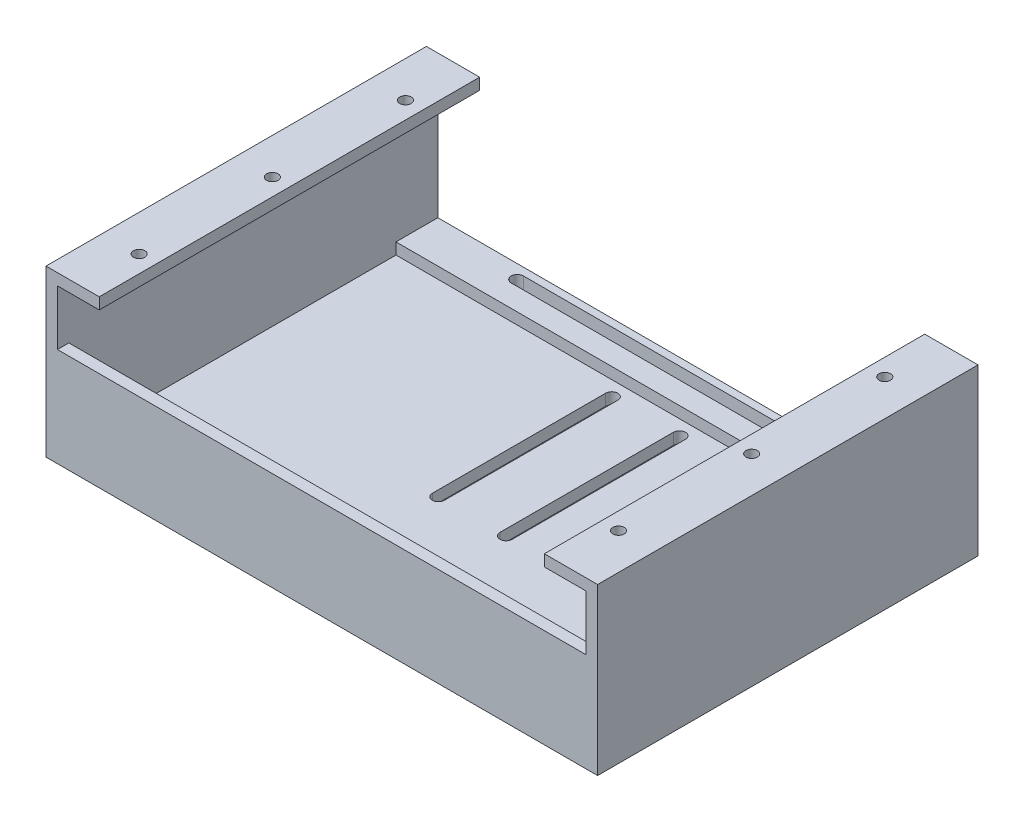
ISO-10303-21;
HEADER;
FILE_DESCRIPTION(('STEP AP214'),'2;1');
FILE_NAME('part.step','',(''),(''),'','','');
FILE_SCHEMA(('AUTOMOTIVE_DESIGN { 1 0 10303 214 1 1 1 1 }'));
ENDSEC;
DATA;
#1=APPLICATION_CONTEXT('core data for automotive mechanical design processes');
#2=APPLICATION_PROTOCOL_DEFINITION('international standard','automotive_design',2000,#1);
#3=PRODUCT_CONTEXT('',#1,'mechanical');
#4=PRODUCT('Part','Part','',(#3));
#5=PRODUCT_RELATED_PRODUCT_CATEGORY('part','',(#4));
#6=PRODUCT_DEFINITION_FORMATION('','',#4);
#7=PRODUCT_DEFINITION_CONTEXT('part definition',#1,'design');
#8=PRODUCT_DEFINITION('design','',#6,#7);
#9=PRODUCT_DEFINITION_SHAPE('','',#8);
#10=(LENGTH_UNIT() NAMED_UNIT(*) SI_UNIT(.MILLI.,.METRE.));
#11=(NAMED_UNIT(*) PLANE_ANGLE_UNIT() SI_UNIT($,.RADIAN.));
#12=(NAMED_UNIT(*) SI_UNIT($,.STERADIAN.) SOLID_ANGLE_UNIT());
#13=UNCERTAINTY_MEASURE_WITH_UNIT(LENGTH_MEASURE(1.E-05),#10,'distance_accuracy_value','');
#14=(GEOMETRIC_REPRESENTATION_CONTEXT(3) GLOBAL_UNCERTAINTY_ASSIGNED_CONTEXT((#13)) GLOBAL_UNIT_ASSIGNED_CONTEXT((#10,
#11,#12)) REPRESENTATION_CONTEXT('',''));
#15=CARTESIAN_POINT('',(0.,0.,0.));
#16=DIRECTION('',(0.,0.,1.));
#17=DIRECTION('',(1.,0.,0.));
#18=AXIS2_PLACEMENT_3D('',#15,#16,#17);
#19=CARTESIAN_POINT('',(69.5,43.5,0.));
#20=DIRECTION('',(-1.,0.,0.));
#21=DIRECTION('',(0.,0.,1.));
#22=AXIS2_PLACEMENT_3D('',#19,#20,#21);
#23=PLANE('',#22);
#24=DIRECTION('',(0.,0.,-1.));
#25=VECTOR('',#24,1.);
#26=CARTESIAN_POINT('',(69.5,6.,-50.));
#27=LINE('',#26,#25);
#28=CARTESIAN_POINT('',(69.5,6.,-39.));
#29=VERTEX_POINT('',#28);
#30=CARTESIAN_POINT('',(69.5,6.,-50.));
#31=VERTEX_POINT('',#30);
#32=EDGE_CURVE('E291',#29,#31,#27,.T.);
#33=ORIENTED_EDGE('',*,*,#32,.F.);
#34=DIRECTION('',(0.,1.,0.));
#35=VECTOR('',#34,1.);
#36=CARTESIAN_POINT('',(69.5,6.,-39.));
#37=LINE('',#36,#35);
#38=CARTESIAN_POINT('',(69.5,3.,-39.));
#39=VERTEX_POINT('',#38);
#40=EDGE_CURVE('E286',#39,#29,#37,.T.);
#41=ORIENTED_EDGE('',*,*,#40,.F.);
#42=DIRECTION('',(0.,0.,-1.));
#43=VECTOR('',#42,1.);
#44=CARTESIAN_POINT('',(69.5,3.,0.));
#45=LINE('',#44,#43);
#46=CARTESIAN_POINT('',(69.5,3.,47.));
#47=VERTEX_POINT('',#46);
#48=EDGE_CURVE('E529',#47,#39,#45,.T.);
#49=ORIENTED_EDGE('',*,*,#48,.F.);
#50=DIRECTION('',(0.,-1.,0.));
#51=VECTOR('',#50,1.);
#52=CARTESIAN_POINT('',(69.5,26.,47.));
#53=LINE('',#52,#51);
#54=CARTESIAN_POINT('',(69.5,26.,47.));
#55=VERTEX_POINT('',#54);
#56=EDGE_CURVE('E518',#55,#47,#53,.T.);
#57=ORIENTED_EDGE('',*,*,#56,.F.);
#58=DIRECTION('',(0.,0.,-1.));
#59=VECTOR('',#58,1.);
#60=CARTESIAN_POINT('',(69.5,26.,50.));
#61=LINE('',#60,#59);
#62=CARTESIAN_POINT('',(69.5,26.,50.));
#63=VERTEX_POINT('',#62);
#64=EDGE_CURVE('E503',#63,#55,#61,.T.);
#65=ORIENTED_EDGE('',*,*,#64,.F.);
#66=DIRECTION('',(0.,-1.,0.));
#67=VECTOR('',#66,1.);
#68=CARTESIAN_POINT('',(69.5,43.5,50.));
#69=LINE('',#68,#67);
#70=CARTESIAN_POINT('',(69.5,40.5,50.));
#71=VERTEX_POINT('',#70);
#72=EDGE_CURVE('E522',#71,#63,#69,.T.);
#73=ORIENTED_EDGE('',*,*,#72,.F.);
#74=DIRECTION('',(0.,0.,-1.));
#75=VECTOR('',#74,1.);
#76=CARTESIAN_POINT('',(69.5,40.5,0.));
#77=LINE('',#76,#75);
#78=CARTESIAN_POINT('',(69.5,40.5,-50.));
#79=VERTEX_POINT('',#78);
#80=EDGE_CURVE('E454',#71,#79,#77,.T.);
#81=ORIENTED_EDGE('',*,*,#80,.T.);
#82=DIRECTION('',(0.,-1.,0.));
#83=VECTOR('',#82,1.);
#84=CARTESIAN_POINT('',(69.5,43.5,-50.));
#85=LINE('',#84,#83);
#86=EDGE_CURVE('E523',#79,#31,#85,.T.);
#87=ORIENTED_EDGE('',*,*,#86,.T.);
#88=EDGE_LOOP('',(#33,#41,#49,#57,#65,#73,#81,#87));
#89=FACE_BOUND('',#88,.T.);
#90=ADVANCED_FACE('F45',(#89),#23,.T.);
#91=CARTESIAN_POINT('',(0.,3.,0.));
#92=DIRECTION('',(0.,1.,0.));
#93=DIRECTION('',(0.,0.,1.));
#94=AXIS2_PLACEMENT_3D('',#91,#92,#93);
#95=PLANE('',#94);
#96=CARTESIAN_POINT('',(-8.90000000000001,3.,10.4482548339604));
#97=DIRECTION('',(0.,1.,0.));
#98=DIRECTION('',(0.,0.,1.));
#99=AXIS2_PLACEMENT_3D('',#96,#97,#98);
#100=CIRCLE('',#99,1.59999999999999);
#101=CARTESIAN_POINT('',(-7.30000000000001,3.,10.4482548339604));
#102=VERTEX_POINT('',#101);
#103=CARTESIAN_POINT('',(-10.5,3.,10.4482548339604));
#104=VERTEX_POINT('',#103);
#105=EDGE_CURVE('E315',#102,#104,#100,.F.);
#106=ORIENTED_EDGE('',*,*,#105,.T.);
#107=DIRECTION('',(0.,0.,-1.));
#108=VECTOR('',#107,1.);
#109=CARTESIAN_POINT('',(-10.5,3.,10.4482548339604));
#110=LINE('',#109,#108);
#111=CARTESIAN_POINT('',(-10.5,3.,-35.1174060690302));
#112=VERTEX_POINT('',#111);
#113=EDGE_CURVE('E338',#104,#112,#110,.T.);
#114=ORIENTED_EDGE('',*,*,#113,.T.);
#115=CARTESIAN_POINT('',(-8.90000000000001,3.,-35.1174060690302));
#116=DIRECTION('',(0.,1.,0.));
#117=DIRECTION('',(0.,0.,1.));
#118=AXIS2_PLACEMENT_3D('',#115,#116,#117);
#119=CIRCLE('',#118,1.60000000000003);
#120=CARTESIAN_POINT('',(-7.29999999999999,3.,-35.1174060690302));
#121=VERTEX_POINT('',#120);
#122=EDGE_CURVE('E306',#112,#121,#119,.F.);
#123=ORIENTED_EDGE('',*,*,#122,.T.);
#124=DIRECTION('',(0.,0.,1.));
#125=VECTOR('',#124,1.);
#126=CARTESIAN_POINT('',(-7.30000000000001,3.,10.4482548339604));
#127=LINE('',#126,#125);
#128=EDGE_CURVE('E310',#121,#102,#127,.T.);
#129=ORIENTED_EDGE('',*,*,#128,.T.);
#130=EDGE_LOOP('',(#106,#114,#123,#129));
#131=FACE_BOUND('',#130,.T.);
#132=CARTESIAN_POINT('',(8.90000000000001,3.,10.4482548339604));
#133=DIRECTION('',(0.,1.,0.));
#134=DIRECTION('',(0.,0.,1.));
#135=AXIS2_PLACEMENT_3D('',#132,#133,#134);
#136=CIRCLE('',#135,1.59999999999999);
#137=CARTESIAN_POINT('',(10.5,3.,10.4482548339604));
#138=VERTEX_POINT('',#137);
#139=CARTESIAN_POINT('',(7.30000000000001,3.,10.4482548339604));
#140=VERTEX_POINT('',#139);
#141=EDGE_CURVE('E383',#138,#140,#136,.F.);
#142=ORIENTED_EDGE('',*,*,#141,.T.);
#143=DIRECTION('',(0.,0.,-1.));
#144=VECTOR('',#143,1.);
#145=CARTESIAN_POINT('',(7.30000000000001,3.,10.4482548339604));
#146=LINE('',#145,#144);
#147=CARTESIAN_POINT('',(7.29999999999998,3.,-35.1174060690302));
#148=VERTEX_POINT('',#147);
#149=EDGE_CURVE('E290',#140,#148,#146,.T.);
#150=ORIENTED_EDGE('',*,*,#149,.T.);
#151=CARTESIAN_POINT('',(8.90000000000003,3.,-35.1174060690302));
#152=DIRECTION('',(0.,1.,0.));
#153=DIRECTION('',(0.,0.,1.));
#154=AXIS2_PLACEMENT_3D('',#151,#152,#153);
#155=CIRCLE('',#154,1.60000000000003);
#156=CARTESIAN_POINT('',(10.5000000000001,3.,-35.1174060690302));
#157=VERTEX_POINT('',#156);
#158=EDGE_CURVE('E311',#148,#157,#155,.F.);
#159=ORIENTED_EDGE('',*,*,#158,.T.);
#160=DIRECTION('',(0.,0.,1.));
#161=VECTOR('',#160,1.);
#162=CARTESIAN_POINT('',(10.5,3.,10.4482548339604));
#163=LINE('',#162,#161);
#164=EDGE_CURVE('E387',#157,#138,#163,.T.);
#165=ORIENTED_EDGE('',*,*,#164,.T.);
#166=EDGE_LOOP('',(#142,#150,#159,#165));
#167=FACE_BOUND('',#166,.T.);
#168=ORIENTED_EDGE('',*,*,#48,.T.);
#169=DIRECTION('',(1.,0.,0.));
#170=VECTOR('',#169,1.);
#171=CARTESIAN_POINT('',(-72.502,3.,-39.));
#172=LINE('',#171,#170);
#173=CARTESIAN_POINT('',(-69.5,3.,-39.));
#174=VERTEX_POINT('',#173);
#175=EDGE_CURVE('E295',#174,#39,#172,.T.);
#176=ORIENTED_EDGE('',*,*,#175,.F.);
#177=DIRECTION('',(0.,0.,1.));
#178=VECTOR('',#177,1.);
#179=CARTESIAN_POINT('',(-69.5,3.,0.));
#180=LINE('',#179,#178);
#181=CARTESIAN_POINT('',(-69.5,3.,47.));
#182=VERTEX_POINT('',#181);
#183=EDGE_CURVE('E533',#174,#182,#180,.T.);
#184=ORIENTED_EDGE('',*,*,#183,.T.);
#185=DIRECTION('',(-1.,0.,0.));
#186=VECTOR('',#185,1.);
#187=CARTESIAN_POINT('',(69.5,3.,47.));
#188=LINE('',#187,#186);
#189=EDGE_CURVE('E494',#47,#182,#188,.T.);
#190=ORIENTED_EDGE('',*,*,#189,.F.);
#191=EDGE_LOOP('',(#168,#176,#184,#190));
#192=FACE_BOUND('',#191,.T.);
#193=ADVANCED_FACE('F641',(#131,#167,#192),#95,.T.);
#194=CARTESIAN_POINT('',(-69.5,43.5,0.));
#195=DIRECTION('',(1.,0.,0.));
#196=DIRECTION('',(0.,0.,-1.));
#197=AXIS2_PLACEMENT_3D('',#194,#195,#196);
#198=PLANE('',#197);
#199=ORIENTED_EDGE('',*,*,#183,.F.);
#200=DIRECTION('',(0.,-1.,0.));
#201=VECTOR('',#200,1.);
#202=CARTESIAN_POINT('',(-69.5,6.,-39.));
#203=LINE('',#202,#201);
#204=CARTESIAN_POINT('',(-69.5,6.,-39.));
#205=VERTEX_POINT('',#204);
#206=EDGE_CURVE('E246',#205,#174,#203,.T.);
#207=ORIENTED_EDGE('',*,*,#206,.F.);
#208=DIRECTION('',(0.,0.,1.));
#209=VECTOR('',#208,1.);
#210=CARTESIAN_POINT('',(-69.5,6.,-50.));
#211=LINE('',#210,#209);
#212=CARTESIAN_POINT('',(-69.5,6.,-50.));
#213=VERTEX_POINT('',#212);
#214=EDGE_CURVE('E281',#213,#205,#211,.T.);
#215=ORIENTED_EDGE('',*,*,#214,.F.);
#216=DIRECTION('',(0.,-1.,0.));
#217=VECTOR('',#216,1.);
#218=CARTESIAN_POINT('',(-69.5,43.5,-50.));
#219=LINE('',#218,#217);
#220=CARTESIAN_POINT('',(-69.5,40.5,-50.));
#221=VERTEX_POINT('',#220);
#222=EDGE_CURVE('E558',#221,#213,#219,.T.);
#223=ORIENTED_EDGE('',*,*,#222,.F.);
#224=DIRECTION('',(0.,0.,-1.));
#225=VECTOR('',#224,1.);
#226=CARTESIAN_POINT('',(-69.5,40.5,0.));
#227=LINE('',#226,#225);
#228=CARTESIAN_POINT('',(-69.5,40.5,50.));
#229=VERTEX_POINT('',#228);
#230=EDGE_CURVE('E487',#229,#221,#227,.T.);
#231=ORIENTED_EDGE('',*,*,#230,.F.);
#232=DIRECTION('',(0.,-1.,0.));
#233=VECTOR('',#232,1.);
#234=CARTESIAN_POINT('',(-69.5,43.5,50.));
#235=LINE('',#234,#233);
#236=CARTESIAN_POINT('',(-69.5,26.,50.));
#237=VERTEX_POINT('',#236);
#238=EDGE_CURVE('E555',#229,#237,#235,.T.);
#239=ORIENTED_EDGE('',*,*,#238,.T.);
#240=DIRECTION('',(0.,0.,1.));
#241=VECTOR('',#240,1.);
#242=CARTESIAN_POINT('',(-69.5,26.,47.));
#243=LINE('',#242,#241);
#244=CARTESIAN_POINT('',(-69.5,26.,47.));
#245=VERTEX_POINT('',#244);
#246=EDGE_CURVE('E495',#245,#237,#243,.T.);
#247=ORIENTED_EDGE('',*,*,#246,.F.);
#248=DIRECTION('',(0.,-1.,0.));
#249=VECTOR('',#248,1.);
#250=CARTESIAN_POINT('',(-69.5,26.,47.));
#251=LINE('',#250,#249);
#252=EDGE_CURVE('E511',#245,#182,#251,.T.);
#253=ORIENTED_EDGE('',*,*,#252,.T.);
#254=EDGE_LOOP('',(#199,#207,#215,#223,#231,#239,#247,#253));
#255=FACE_BOUND('',#254,.T.);
#256=ADVANCED_FACE('F634',(#255),#198,.T.);
#257=CARTESIAN_POINT('',(72.5,3.,-50.));
#258=DIRECTION('',(-1.,0.,0.));
#259=DIRECTION('',(0.,0.,1.));
#260=AXIS2_PLACEMENT_3D('',#257,#258,#259);
#261=PLANE('',#260);
#262=DIRECTION('',(0.,-1.,0.));
#263=VECTOR('',#262,1.);
#264=CARTESIAN_POINT('',(72.5,3.,50.));
#265=LINE('',#264,#263);
#266=CARTESIAN_POINT('',(72.5,43.5,50.));
#267=VERTEX_POINT('',#266);
#268=CARTESIAN_POINT('',(72.5,0.,50.));
#269=VERTEX_POINT('',#268);
#270=EDGE_CURVE('E580',#267,#269,#265,.T.);
#271=ORIENTED_EDGE('',*,*,#270,.T.);
#272=DIRECTION('',(0.,0.,-1.));
#273=VECTOR('',#272,1.);
#274=CARTESIAN_POINT('',(72.5,0.,-50.));
#275=LINE('',#274,#273);
#276=CARTESIAN_POINT('',(72.5,0.,-50.));
#277=VERTEX_POINT('',#276);
#278=EDGE_CURVE('E562',#269,#277,#275,.T.);
#279=ORIENTED_EDGE('',*,*,#278,.T.);
#280=DIRECTION('',(0.,-1.,0.));
#281=VECTOR('',#280,1.);
#282=CARTESIAN_POINT('',(72.5,3.,-50.));
#283=LINE('',#282,#281);
#284=CARTESIAN_POINT('',(72.5,43.5,-50.));
#285=VERTEX_POINT('',#284);
#286=EDGE_CURVE('E11',#285,#277,#283,.T.);
#287=ORIENTED_EDGE('',*,*,#286,.F.);
#288=DIRECTION('',(0.,0.,1.));
#289=VECTOR('',#288,1.);
#290=CARTESIAN_POINT('',(72.5,43.5,0.));
#291=LINE('',#290,#289);
#292=EDGE_CURVE('E537',#285,#267,#291,.T.);
#293=ORIENTED_EDGE('',*,*,#292,.T.);
#294=EDGE_LOOP('',(#271,#279,#287,#293));
#295=FACE_BOUND('',#294,.T.);
#296=ADVANCED_FACE('F47',(#295),#261,.F.);
#297=CARTESIAN_POINT('',(-72.5,3.,-50.));
#298=DIRECTION('',(0.,0.,1.));
#299=DIRECTION('',(1.,0.,0.));
#300=AXIS2_PLACEMENT_3D('',#297,#298,#299);
#301=PLANE('',#300);
#302=ORIENTED_EDGE('',*,*,#286,.T.);
#303=DIRECTION('',(-1.,0.,0.));
#304=VECTOR('',#303,1.);
#305=CARTESIAN_POINT('',(-72.5,0.,-50.));
#306=LINE('',#305,#304);
#307=CARTESIAN_POINT('',(-72.5,0.,-50.));
#308=VERTEX_POINT('',#307);
#309=EDGE_CURVE('E568',#277,#308,#306,.T.);
#310=ORIENTED_EDGE('',*,*,#309,.T.);
#311=DIRECTION('',(0.,-1.,0.));
#312=VECTOR('',#311,1.);
#313=CARTESIAN_POINT('',(-72.5,3.,-50.));
#314=LINE('',#313,#312);
#315=CARTESIAN_POINT('',(-72.5,43.5,-50.));
#316=VERTEX_POINT('',#315);
#317=EDGE_CURVE('E54',#316,#308,#314,.T.);
#318=ORIENTED_EDGE('',*,*,#317,.F.);
#319=DIRECTION('',(1.,0.,0.));
#320=VECTOR('',#319,1.);
#321=CARTESIAN_POINT('',(0.,43.5,-50.));
#322=LINE('',#321,#320);
#323=CARTESIAN_POINT('',(-58.5,43.5,-50.));
#324=VERTEX_POINT('',#323);
#325=EDGE_CURVE('E552',#316,#324,#322,.T.);
#326=ORIENTED_EDGE('',*,*,#325,.T.);
#327=DIRECTION('',(0.,1.,0.));
#328=VECTOR('',#327,1.);
#329=CARTESIAN_POINT('',(-58.5,40.5,-50.));
#330=LINE('',#329,#328);
#331=CARTESIAN_POINT('',(-58.5,40.5,-50.));
#332=VERTEX_POINT('',#331);
#333=EDGE_CURVE('E483',#332,#324,#330,.T.);
#334=ORIENTED_EDGE('',*,*,#333,.F.);
#335=DIRECTION('',(-1.,0.,0.));
#336=VECTOR('',#335,1.);
#337=CARTESIAN_POINT('',(-72.5,40.5,-50.));
#338=LINE('',#337,#336);
#339=EDGE_CURVE('E475',#332,#221,#338,.T.);
#340=ORIENTED_EDGE('',*,*,#339,.T.);
#341=ORIENTED_EDGE('',*,*,#222,.T.);
#342=DIRECTION('',(1.,0.,0.));
#343=VECTOR('',#342,1.);
#344=CARTESIAN_POINT('',(-72.502,6.,-50.));
#345=LINE('',#344,#343);
#346=EDGE_CURVE('E299',#213,#31,#345,.T.);
#347=ORIENTED_EDGE('',*,*,#346,.T.);
#348=ORIENTED_EDGE('',*,*,#86,.F.);
#349=DIRECTION('',(-1.,0.,0.));
#350=VECTOR('',#349,1.);
#351=CARTESIAN_POINT('',(72.5,40.5,-50.));
#352=LINE('',#351,#350);
#353=CARTESIAN_POINT('',(58.5,40.5,-50.));
#354=VERTEX_POINT('',#353);
#355=EDGE_CURVE('E459',#79,#354,#352,.T.);
#356=ORIENTED_EDGE('',*,*,#355,.T.);
#357=DIRECTION('',(0.,1.,0.));
#358=VECTOR('',#357,1.);
#359=CARTESIAN_POINT('',(58.5,40.5,-50.));
#360=LINE('',#359,#358);
#361=CARTESIAN_POINT('',(58.5,43.5,-50.));
#362=VERTEX_POINT('',#361);
#363=EDGE_CURVE('E442',#354,#362,#360,.T.);
#364=ORIENTED_EDGE('',*,*,#363,.T.);
#365=DIRECTION('',(1.,0.,0.));
#366=VECTOR('',#365,1.);
#367=CARTESIAN_POINT('',(0.,43.5,-50.));
#368=LINE('',#367,#366);
#369=EDGE_CURVE('E534',#362,#285,#368,.T.);
#370=ORIENTED_EDGE('',*,*,#369,.T.);
#371=EDGE_LOOP('',(#302,#310,#318,#326,#334,#340,#341,#347,#348,#356,#364,#370));
#372=FACE_BOUND('',#371,.T.);
#373=ADVANCED_FACE('F594',(#372),#301,.F.);
#374=CARTESIAN_POINT('',(-72.5,3.,-50.));
#375=DIRECTION('',(1.,0.,0.));
#376=DIRECTION('',(0.,0.,-1.));
#377=AXIS2_PLACEMENT_3D('',#374,#375,#376);
#378=PLANE('',#377);
#379=DIRECTION('',(0.,0.,1.));
#380=VECTOR('',#379,1.);
#381=CARTESIAN_POINT('',(-72.5,0.,-50.));
#382=LINE('',#381,#380);
#383=CARTESIAN_POINT('',(-72.5,0.,50.));
#384=VERTEX_POINT('',#383);
#385=EDGE_CURVE('E572',#308,#384,#382,.T.);
#386=ORIENTED_EDGE('',*,*,#385,.T.);
#387=DIRECTION('',(0.,-1.,0.));
#388=VECTOR('',#387,1.);
#389=CARTESIAN_POINT('',(-72.5,3.,50.));
#390=LINE('',#389,#388);
#391=CARTESIAN_POINT('',(-72.5,43.5,50.));
#392=VERTEX_POINT('',#391);
#393=EDGE_CURVE('E583',#392,#384,#390,.T.);
#394=ORIENTED_EDGE('',*,*,#393,.F.);
#395=DIRECTION('',(0.,0.,-1.));
#396=VECTOR('',#395,1.);
#397=CARTESIAN_POINT('',(-72.5,43.5,0.));
#398=LINE('',#397,#396);
#399=EDGE_CURVE('E548',#392,#316,#398,.T.);
#400=ORIENTED_EDGE('',*,*,#399,.T.);
#401=ORIENTED_EDGE('',*,*,#317,.T.);
#402=EDGE_LOOP('',(#386,#394,#400,#401));
#403=FACE_BOUND('',#402,.T.);
#404=ADVANCED_FACE('F587',(#403),#378,.F.);
#405=CARTESIAN_POINT('',(-72.5,3.,50.));
#406=DIRECTION('',(0.,0.,-1.));
#407=DIRECTION('',(-1.,0.,0.));
#408=AXIS2_PLACEMENT_3D('',#405,#406,#407);
#409=PLANE('',#408);
#410=DIRECTION('',(-1.,0.,0.));
#411=VECTOR('',#410,1.);
#412=CARTESIAN_POINT('',(0.,43.5,50.));
#413=LINE('',#412,#411);
#414=CARTESIAN_POINT('',(58.5,43.5,50.));
#415=VERTEX_POINT('',#414);
#416=EDGE_CURVE('E526',#267,#415,#413,.T.);
#417=ORIENTED_EDGE('',*,*,#416,.T.);
#418=DIRECTION('',(0.,1.,0.));
#419=VECTOR('',#418,1.);
#420=CARTESIAN_POINT('',(58.5,40.5,50.));
#421=LINE('',#420,#419);
#422=CARTESIAN_POINT('',(58.5,40.5,50.));
#423=VERTEX_POINT('',#422);
#424=EDGE_CURVE('E438',#423,#415,#421,.T.);
#425=ORIENTED_EDGE('',*,*,#424,.F.);
#426=DIRECTION('',(1.,0.,0.));
#427=VECTOR('',#426,1.);
#428=CARTESIAN_POINT('',(58.5,40.5,50.));
#429=LINE('',#428,#427);
#430=EDGE_CURVE('E455',#423,#71,#429,.T.);
#431=ORIENTED_EDGE('',*,*,#430,.T.);
#432=ORIENTED_EDGE('',*,*,#72,.T.);
#433=DIRECTION('',(1.,0.,0.));
#434=VECTOR('',#433,1.);
#435=CARTESIAN_POINT('',(-69.5,26.,50.));
#436=LINE('',#435,#434);
#437=EDGE_CURVE('E499',#237,#63,#436,.T.);
#438=ORIENTED_EDGE('',*,*,#437,.F.);
#439=ORIENTED_EDGE('',*,*,#238,.F.);
#440=DIRECTION('',(1.,0.,0.));
#441=VECTOR('',#440,1.);
#442=CARTESIAN_POINT('',(-58.5,40.5,50.));
#443=LINE('',#442,#441);
#444=CARTESIAN_POINT('',(-58.5,40.5,50.));
#445=VERTEX_POINT('',#444);
#446=EDGE_CURVE('E468',#229,#445,#443,.T.);
#447=ORIENTED_EDGE('',*,*,#446,.T.);
#448=DIRECTION('',(0.,1.,0.));
#449=VECTOR('',#448,1.);
#450=CARTESIAN_POINT('',(-58.5,40.5,50.));
#451=LINE('',#450,#449);
#452=CARTESIAN_POINT('',(-58.5,43.5,50.));
#453=VERTEX_POINT('',#452);
#454=EDGE_CURVE('E479',#445,#453,#451,.T.);
#455=ORIENTED_EDGE('',*,*,#454,.T.);
#456=DIRECTION('',(-1.,0.,0.));
#457=VECTOR('',#456,1.);
#458=CARTESIAN_POINT('',(0.,43.5,50.));
#459=LINE('',#458,#457);
#460=EDGE_CURVE('E544',#453,#392,#459,.T.);
#461=ORIENTED_EDGE('',*,*,#460,.T.);
#462=ORIENTED_EDGE('',*,*,#393,.T.);
#463=DIRECTION('',(1.,0.,0.));
#464=VECTOR('',#463,1.);
#465=CARTESIAN_POINT('',(-72.5,0.,50.));
#466=LINE('',#465,#464);
#467=EDGE_CURVE('E576',#384,#269,#466,.T.);
#468=ORIENTED_EDGE('',*,*,#467,.T.);
#469=ORIENTED_EDGE('',*,*,#270,.F.);
#470=EDGE_LOOP('',(#417,#425,#431,#432,#438,#439,#447,#455,#461,#462,#468,#469));
#471=FACE_BOUND('',#470,.T.);
#472=ADVANCED_FACE('F598',(#471),#409,.F.);
#473=CARTESIAN_POINT('',(0.,0.,0.));
#474=DIRECTION('',(0.,1.,0.));
#475=DIRECTION('',(0.,0.,1.));
#476=AXIS2_PLACEMENT_3D('',#473,#474,#475);
#477=PLANE('',#476);
#478=DIRECTION('',(1.,0.,0.));
#479=VECTOR('',#478,1.);
#480=CARTESIAN_POINT('',(-45.,0.,-48.));
#481=LINE('',#480,#479);
#482=CARTESIAN_POINT('',(-45.,0.,-48.));
#483=VERTEX_POINT('',#482);
#484=CARTESIAN_POINT('',(45.,0.,-48.));
#485=VERTEX_POINT('',#484);
#486=EDGE_CURVE('E252',#483,#485,#481,.T.);
#487=ORIENTED_EDGE('',*,*,#486,.F.);
#488=CARTESIAN_POINT('',(-45.,0.,-46.4));
#489=DIRECTION('',(0.,1.,0.));
#490=DIRECTION('',(0.,0.,1.));
#491=AXIS2_PLACEMENT_3D('',#488,#489,#490);
#492=CIRCLE('',#491,1.6);
#493=CARTESIAN_POINT('',(-45.,0.,-44.8));
#494=VERTEX_POINT('',#493);
#495=EDGE_CURVE('E232',#494,#483,#492,.F.);
#496=ORIENTED_EDGE('',*,*,#495,.F.);
#497=DIRECTION('',(-1.,0.,0.));
#498=VECTOR('',#497,1.);
#499=CARTESIAN_POINT('',(-45.,0.,-44.8));
#500=LINE('',#499,#498);
#501=CARTESIAN_POINT('',(45.,0.,-44.8));
#502=VERTEX_POINT('',#501);
#503=EDGE_CURVE('E242',#502,#494,#500,.T.);
#504=ORIENTED_EDGE('',*,*,#503,.F.);
#505=CARTESIAN_POINT('',(45.,0.,-46.4));
#506=DIRECTION('',(0.,1.,0.));
#507=DIRECTION('',(0.,0.,1.));
#508=AXIS2_PLACEMENT_3D('',#505,#506,#507);
#509=CIRCLE('',#508,1.59999999999999);
#510=EDGE_CURVE('E61',#485,#502,#509,.F.);
#511=ORIENTED_EDGE('',*,*,#510,.F.);
#512=EDGE_LOOP('',(#487,#496,#504,#511));
#513=FACE_BOUND('',#512,.T.);
#514=DIRECTION('',(0.,0.,-1.));
#515=VECTOR('',#514,1.);
#516=CARTESIAN_POINT('',(-10.5,0.,10.4482548339604));
#517=LINE('',#516,#515);
#518=CARTESIAN_POINT('',(-10.5,0.,10.4482548339604));
#519=VERTEX_POINT('',#518);
#520=CARTESIAN_POINT('',(-10.5,0.,-35.1174060690302));
#521=VERTEX_POINT('',#520);
#522=EDGE_CURVE('E322',#519,#521,#517,.T.);
#523=ORIENTED_EDGE('',*,*,#522,.F.);
#524=CARTESIAN_POINT('',(-8.90000000000001,0.,10.4482548339604));
#525=DIRECTION('',(0.,-1.,0.));
#526=DIRECTION('',(0.,0.,-1.));
#527=AXIS2_PLACEMENT_3D('',#524,#525,#526);
#528=CIRCLE('',#527,1.59999999999999);
#529=CARTESIAN_POINT('',(-7.30000000000001,0.,10.4482548339604));
#530=VERTEX_POINT('',#529);
#531=EDGE_CURVE('E319',#530,#519,#528,.T.);
#532=ORIENTED_EDGE('',*,*,#531,.F.);
#533=DIRECTION('',(0.,0.,1.));
#534=VECTOR('',#533,1.);
#535=CARTESIAN_POINT('',(-7.30000000000001,0.,10.4482548339604));
#536=LINE('',#535,#534);
#537=CARTESIAN_POINT('',(-7.29999999999996,0.,-35.1174060690302));
#538=VERTEX_POINT('',#537);
#539=EDGE_CURVE('E330',#538,#530,#536,.T.);
#540=ORIENTED_EDGE('',*,*,#539,.F.);
#541=CARTESIAN_POINT('',(-8.90000000000001,0.,-35.1174060690302));
#542=DIRECTION('',(0.,-1.,0.));
#543=DIRECTION('',(0.,0.,-1.));
#544=AXIS2_PLACEMENT_3D('',#541,#542,#543);
#545=CIRCLE('',#544,1.60000000000003);
#546=EDGE_CURVE('E326',#521,#538,#545,.T.);
#547=ORIENTED_EDGE('',*,*,#546,.F.);
#548=EDGE_LOOP('',(#523,#532,#540,#547));
#549=FACE_BOUND('',#548,.T.);
#550=DIRECTION('',(0.,0.,-1.));
#551=VECTOR('',#550,1.);
#552=CARTESIAN_POINT('',(7.30000000000001,0.,10.4482548339604));
#553=LINE('',#552,#551);
#554=CARTESIAN_POINT('',(7.30000000000001,0.,10.4482548339604));
#555=VERTEX_POINT('',#554);
#556=CARTESIAN_POINT('',(7.29999999999998,0.,-35.1174060690302));
#557=VERTEX_POINT('',#556);
#558=EDGE_CURVE('E376',#555,#557,#553,.T.);
#559=ORIENTED_EDGE('',*,*,#558,.F.);
#560=CARTESIAN_POINT('',(8.90000000000001,0.,10.4482548339604));
#561=DIRECTION('',(0.,-1.,0.));
#562=DIRECTION('',(0.,0.,1.));
#563=AXIS2_PLACEMENT_3D('',#560,#561,#562);
#564=CIRCLE('',#563,1.59999999999999);
#565=CARTESIAN_POINT('',(10.5,0.,10.4482548339604));
#566=VERTEX_POINT('',#565);
#567=EDGE_CURVE('E380',#566,#555,#564,.T.);
#568=ORIENTED_EDGE('',*,*,#567,.F.);
#569=DIRECTION('',(0.,0.,1.));
#570=VECTOR('',#569,1.);
#571=CARTESIAN_POINT('',(10.5,0.,10.4482548339604));
#572=LINE('',#571,#570);
#573=CARTESIAN_POINT('',(10.5000000000001,0.,-35.1174060690302));
#574=VERTEX_POINT('',#573);
#575=EDGE_CURVE('E360',#574,#566,#572,.T.);
#576=ORIENTED_EDGE('',*,*,#575,.F.);
#577=CARTESIAN_POINT('',(8.90000000000003,0.,-35.1174060690302));
#578=DIRECTION('',(0.,-1.,0.));
#579=DIRECTION('',(0.,0.,1.));
#580=AXIS2_PLACEMENT_3D('',#577,#578,#579);
#581=CIRCLE('',#580,1.60000000000003);
#582=EDGE_CURVE('E372',#557,#574,#581,.T.);
#583=ORIENTED_EDGE('',*,*,#582,.F.);
#584=EDGE_LOOP('',(#559,#568,#576,#583));
#585=FACE_BOUND('',#584,.T.);
#586=ORIENTED_EDGE('',*,*,#278,.F.);
#587=ORIENTED_EDGE('',*,*,#467,.F.);
#588=ORIENTED_EDGE('',*,*,#385,.F.);
#589=ORIENTED_EDGE('',*,*,#309,.F.);
#590=EDGE_LOOP('',(#586,#587,#588,#589));
#591=FACE_BOUND('',#590,.T.);
#592=ADVANCED_FACE('F249',(#513,#549,#585,#591),#477,.F.);
#593=CARTESIAN_POINT('',(0.,43.5,0.));
#594=DIRECTION('',(0.,-1.,0.));
#595=DIRECTION('',(0.,0.,-1.));
#596=AXIS2_PLACEMENT_3D('',#593,#594,#595);
#597=PLANE('',#596);
#598=CARTESIAN_POINT('',(-63.,43.5,35.));
#599=DIRECTION('',(0.,1.,0.));
#600=DIRECTION('',(0.,0.,1.));
#601=AXIS2_PLACEMENT_3D('',#598,#599,#600);
#602=CIRCLE('',#601,1.5);
#603=CARTESIAN_POINT('',(-63.,43.5,36.5));
#604=VERTEX_POINT('',#603);
#605=EDGE_CURVE('E403',#604,#604,#602,.T.);
#606=ORIENTED_EDGE('',*,*,#605,.F.);
#607=EDGE_LOOP('',(#606));
#608=FACE_BOUND('',#607,.T.);
#609=CARTESIAN_POINT('',(-63.,43.5,0.));
#610=DIRECTION('',(0.,1.,0.));
#611=DIRECTION('',(0.,0.,1.));
#612=AXIS2_PLACEMENT_3D('',#609,#610,#611);
#613=CIRCLE('',#612,1.5);
#614=CARTESIAN_POINT('',(-63.,43.5,1.5));
#615=VERTEX_POINT('',#614);
#616=EDGE_CURVE('E394',#615,#615,#613,.T.);
#617=ORIENTED_EDGE('',*,*,#616,.F.);
#618=EDGE_LOOP('',(#617));
#619=FACE_BOUND('',#618,.T.);
#620=CARTESIAN_POINT('',(-63.,43.5,-35.));
#621=DIRECTION('',(0.,1.,0.));
#622=DIRECTION('',(0.,0.,1.));
#623=AXIS2_PLACEMENT_3D('',#620,#621,#622);
#624=CIRCLE('',#623,1.5);
#625=CARTESIAN_POINT('',(-63.,43.5,-33.5));
#626=VERTEX_POINT('',#625);
#627=EDGE_CURVE('E398',#626,#626,#624,.T.);
#628=ORIENTED_EDGE('',*,*,#627,.F.);
#629=EDGE_LOOP('',(#628));
#630=FACE_BOUND('',#629,.T.);
#631=ORIENTED_EDGE('',*,*,#460,.F.);
#632=DIRECTION('',(0.,0.,-1.));
#633=VECTOR('',#632,1.);
#634=CARTESIAN_POINT('',(-58.5,43.5,-50.));
#635=LINE('',#634,#633);
#636=EDGE_CURVE('E467',#453,#324,#635,.T.);
#637=ORIENTED_EDGE('',*,*,#636,.T.);
#638=ORIENTED_EDGE('',*,*,#325,.F.);
#639=ORIENTED_EDGE('',*,*,#399,.F.);
#640=EDGE_LOOP('',(#631,#637,#638,#639));
#641=FACE_BOUND('',#640,.T.);
#642=ADVANCED_FACE('F600',(#608,#619,#630,#641),#597,.F.);
#643=CARTESIAN_POINT('',(0.,43.5,0.));
#644=DIRECTION('',(0.,-1.,0.));
#645=DIRECTION('',(0.,0.,-1.));
#646=AXIS2_PLACEMENT_3D('',#643,#644,#645);
#647=PLANE('',#646);
#648=CARTESIAN_POINT('',(63.,43.5,-35.));
#649=DIRECTION('',(0.,1.,0.));
#650=DIRECTION('',(0.,0.,-1.));
#651=AXIS2_PLACEMENT_3D('',#648,#649,#650);
#652=CIRCLE('',#651,1.5);
#653=CARTESIAN_POINT('',(63.,43.5,-36.5));
#654=VERTEX_POINT('',#653);
#655=EDGE_CURVE('E351',#654,#654,#652,.T.);
#656=ORIENTED_EDGE('',*,*,#655,.F.);
#657=EDGE_LOOP('',(#656));
#658=FACE_BOUND('',#657,.T.);
#659=CARTESIAN_POINT('',(63.,43.5,0.));
#660=DIRECTION('',(0.,1.,0.));
#661=DIRECTION('',(0.,0.,-1.));
#662=AXIS2_PLACEMENT_3D('',#659,#660,#661);
#663=CIRCLE('',#662,1.5);
#664=CARTESIAN_POINT('',(63.,43.5,-1.50000000000001));
#665=VERTEX_POINT('',#664);
#666=EDGE_CURVE('E420',#665,#665,#663,.T.);
#667=ORIENTED_EDGE('',*,*,#666,.F.);
#668=EDGE_LOOP('',(#667));
#669=FACE_BOUND('',#668,.T.);
#670=CARTESIAN_POINT('',(63.,43.5,35.));
#671=DIRECTION('',(0.,1.,0.));
#672=DIRECTION('',(0.,0.,-1.));
#673=AXIS2_PLACEMENT_3D('',#670,#671,#672);
#674=CIRCLE('',#673,1.5);
#675=CARTESIAN_POINT('',(63.,43.5,33.5));
#676=VERTEX_POINT('',#675);
#677=EDGE_CURVE('E412',#676,#676,#674,.T.);
#678=ORIENTED_EDGE('',*,*,#677,.F.);
#679=EDGE_LOOP('',(#678));
#680=FACE_BOUND('',#679,.T.);
#681=ORIENTED_EDGE('',*,*,#369,.F.);
#682=DIRECTION('',(0.,0.,1.));
#683=VECTOR('',#682,1.);
#684=CARTESIAN_POINT('',(58.5,43.5,-50.));
#685=LINE('',#684,#683);
#686=EDGE_CURVE('E450',#362,#415,#685,.T.);
#687=ORIENTED_EDGE('',*,*,#686,.T.);
#688=ORIENTED_EDGE('',*,*,#416,.F.);
#689=ORIENTED_EDGE('',*,*,#292,.F.);
#690=EDGE_LOOP('',(#681,#687,#688,#689));
#691=FACE_BOUND('',#690,.T.);
#692=ADVANCED_FACE('F630',(#658,#669,#680,#691),#647,.F.);
#693=CARTESIAN_POINT('',(69.5,26.,47.));
#694=DIRECTION('',(0.,0.,1.));
#695=DIRECTION('',(1.,0.,0.));
#696=AXIS2_PLACEMENT_3D('',#693,#694,#695);
#697=PLANE('',#696);
#698=ORIENTED_EDGE('',*,*,#189,.T.);
#699=ORIENTED_EDGE('',*,*,#252,.F.);
#700=DIRECTION('',(-1.,0.,0.));
#701=VECTOR('',#700,1.);
#702=CARTESIAN_POINT('',(69.5,26.,47.));
#703=LINE('',#702,#701);
#704=EDGE_CURVE('E507',#55,#245,#703,.T.);
#705=ORIENTED_EDGE('',*,*,#704,.F.);
#706=ORIENTED_EDGE('',*,*,#56,.T.);
#707=EDGE_LOOP('',(#698,#699,#705,#706));
#708=FACE_BOUND('',#707,.T.);
#709=ADVANCED_FACE('F653',(#708),#697,.F.);
#710=CARTESIAN_POINT('',(0.,26.,0.));
#711=DIRECTION('',(0.,1.,0.));
#712=DIRECTION('',(0.,0.,1.));
#713=AXIS2_PLACEMENT_3D('',#710,#711,#712);
#714=PLANE('',#713);
#715=ORIENTED_EDGE('',*,*,#246,.T.);
#716=ORIENTED_EDGE('',*,*,#437,.T.);
#717=ORIENTED_EDGE('',*,*,#64,.T.);
#718=ORIENTED_EDGE('',*,*,#704,.T.);
#719=EDGE_LOOP('',(#715,#716,#717,#718));
#720=FACE_BOUND('',#719,.T.);
#721=ADVANCED_FACE('F682',(#720),#714,.T.);
#722=CARTESIAN_POINT('',(-58.5,40.5,-50.));
#723=DIRECTION('',(1.,0.,0.));
#724=DIRECTION('',(0.,0.,-1.));
#725=AXIS2_PLACEMENT_3D('',#722,#723,#724);
#726=PLANE('',#725);
#727=ORIENTED_EDGE('',*,*,#636,.F.);
#728=ORIENTED_EDGE('',*,*,#454,.F.);
#729=DIRECTION('',(0.,0.,-1.));
#730=VECTOR('',#729,1.);
#731=CARTESIAN_POINT('',(-58.5,40.5,-50.));
#732=LINE('',#731,#730);
#733=EDGE_CURVE('E471',#445,#332,#732,.T.);
#734=ORIENTED_EDGE('',*,*,#733,.T.);
#735=ORIENTED_EDGE('',*,*,#333,.T.);
#736=EDGE_LOOP('',(#727,#728,#734,#735));
#737=FACE_BOUND('',#736,.T.);
#738=ADVANCED_FACE('F603',(#737),#726,.T.);
#739=CARTESIAN_POINT('',(0.,40.5,0.));
#740=DIRECTION('',(0.,-1.,0.));
#741=DIRECTION('',(0.,0.,-1.));
#742=AXIS2_PLACEMENT_3D('',#739,#740,#741);
#743=PLANE('',#742);
#744=CARTESIAN_POINT('',(-63.,40.5,35.));
#745=DIRECTION('',(0.,-1.,0.));
#746=DIRECTION('',(0.,0.,-1.));
#747=AXIS2_PLACEMENT_3D('',#744,#745,#746);
#748=CIRCLE('',#747,1.5);
#749=CARTESIAN_POINT('',(-63.,40.5,33.5));
#750=VERTEX_POINT('',#749);
#751=EDGE_CURVE('E407',#750,#750,#748,.F.);
#752=ORIENTED_EDGE('',*,*,#751,.T.);
#753=EDGE_LOOP('',(#752));
#754=FACE_BOUND('',#753,.T.);
#755=CARTESIAN_POINT('',(-63.,40.5,0.));
#756=DIRECTION('',(0.,-1.,0.));
#757=DIRECTION('',(0.,0.,-1.));
#758=AXIS2_PLACEMENT_3D('',#755,#756,#757);
#759=CIRCLE('',#758,1.5);
#760=CARTESIAN_POINT('',(-63.,40.5,-1.5));
#761=VERTEX_POINT('',#760);
#762=EDGE_CURVE('E399',#761,#761,#759,.F.);
#763=ORIENTED_EDGE('',*,*,#762,.T.);
#764=EDGE_LOOP('',(#763));
#765=FACE_BOUND('',#764,.T.);
#766=CARTESIAN_POINT('',(-63.,40.5,-35.));
#767=DIRECTION('',(0.,-1.,0.));
#768=DIRECTION('',(0.,0.,-1.));
#769=AXIS2_PLACEMENT_3D('',#766,#767,#768);
#770=CIRCLE('',#769,1.5);
#771=CARTESIAN_POINT('',(-63.,40.5,-36.5));
#772=VERTEX_POINT('',#771);
#773=EDGE_CURVE('E434',#772,#772,#770,.F.);
#774=ORIENTED_EDGE('',*,*,#773,.T.);
#775=EDGE_LOOP('',(#774));
#776=FACE_BOUND('',#775,.T.);
#777=ORIENTED_EDGE('',*,*,#446,.F.);
#778=ORIENTED_EDGE('',*,*,#230,.T.);
#779=ORIENTED_EDGE('',*,*,#339,.F.);
#780=ORIENTED_EDGE('',*,*,#733,.F.);
#781=EDGE_LOOP('',(#777,#778,#779,#780));
#782=FACE_BOUND('',#781,.T.);
#783=ADVANCED_FACE('F609',(#754,#765,#776,#782),#743,.T.);
#784=CARTESIAN_POINT('',(58.5,40.5,-50.));
#785=DIRECTION('',(-1.,0.,0.));
#786=DIRECTION('',(0.,0.,1.));
#787=AXIS2_PLACEMENT_3D('',#784,#785,#786);
#788=PLANE('',#787);
#789=ORIENTED_EDGE('',*,*,#686,.F.);
#790=ORIENTED_EDGE('',*,*,#363,.F.);
#791=DIRECTION('',(0.,0.,1.));
#792=VECTOR('',#791,1.);
#793=CARTESIAN_POINT('',(58.5,40.5,-50.));
#794=LINE('',#793,#792);
#795=EDGE_CURVE('E446',#354,#423,#794,.T.);
#796=ORIENTED_EDGE('',*,*,#795,.T.);
#797=ORIENTED_EDGE('',*,*,#424,.T.);
#798=EDGE_LOOP('',(#789,#790,#796,#797));
#799=FACE_BOUND('',#798,.T.);
#800=ADVANCED_FACE('F627',(#799),#788,.T.);
#801=CARTESIAN_POINT('',(0.,40.5,0.));
#802=DIRECTION('',(0.,1.,0.));
#803=DIRECTION('',(0.,0.,1.));
#804=AXIS2_PLACEMENT_3D('',#801,#802,#803);
#805=PLANE('',#804);
#806=CARTESIAN_POINT('',(63.,40.5,-35.));
#807=DIRECTION('',(0.,1.,0.));
#808=DIRECTION('',(0.,0.,1.));
#809=AXIS2_PLACEMENT_3D('',#806,#807,#808);
#810=CIRCLE('',#809,1.5);
#811=CARTESIAN_POINT('',(63.,40.5,-33.5));
#812=VERTEX_POINT('',#811);
#813=EDGE_CURVE('E424',#812,#812,#810,.F.);
#814=ORIENTED_EDGE('',*,*,#813,.F.);
#815=EDGE_LOOP('',(#814));
#816=FACE_BOUND('',#815,.T.);
#817=CARTESIAN_POINT('',(63.,40.5,0.));
#818=DIRECTION('',(0.,1.,0.));
#819=DIRECTION('',(0.,0.,1.));
#820=AXIS2_PLACEMENT_3D('',#817,#818,#819);
#821=CIRCLE('',#820,1.5);
#822=CARTESIAN_POINT('',(63.,40.5,1.49999999999998));
#823=VERTEX_POINT('',#822);
#824=EDGE_CURVE('E416',#823,#823,#821,.F.);
#825=ORIENTED_EDGE('',*,*,#824,.F.);
#826=EDGE_LOOP('',(#825));
#827=FACE_BOUND('',#826,.T.);
#828=CARTESIAN_POINT('',(63.,40.5,35.));
#829=DIRECTION('',(0.,1.,0.));
#830=DIRECTION('',(0.,0.,1.));
#831=AXIS2_PLACEMENT_3D('',#828,#829,#830);
#832=CIRCLE('',#831,1.5);
#833=CARTESIAN_POINT('',(63.,40.5,36.5));
#834=VERTEX_POINT('',#833);
#835=EDGE_CURVE('E411',#834,#834,#832,.F.);
#836=ORIENTED_EDGE('',*,*,#835,.F.);
#837=EDGE_LOOP('',(#836));
#838=FACE_BOUND('',#837,.T.);
#839=ORIENTED_EDGE('',*,*,#80,.F.);
#840=ORIENTED_EDGE('',*,*,#430,.F.);
#841=ORIENTED_EDGE('',*,*,#795,.F.);
#842=ORIENTED_EDGE('',*,*,#355,.F.);
#843=EDGE_LOOP('',(#839,#840,#841,#842));
#844=FACE_BOUND('',#843,.T.);
#845=ADVANCED_FACE('F623',(#816,#827,#838,#844),#805,.F.);
#846=CARTESIAN_POINT('',(63.,-0.001000000000001,35.));
#847=DIRECTION('',(0.,1.,0.));
#848=DIRECTION('',(0.,0.,1.));
#849=AXIS2_PLACEMENT_3D('',#846,#847,#848);
#850=CYLINDRICAL_SURFACE('',#849,1.5);
#851=ORIENTED_EDGE('',*,*,#677,.T.);
#852=EDGE_LOOP('',(#851));
#853=FACE_BOUND('',#852,.T.);
#854=ORIENTED_EDGE('',*,*,#835,.T.);
#855=EDGE_LOOP('',(#854));
#856=FACE_BOUND('',#855,.T.);
#857=ADVANCED_FACE('F714',(#853,#856),#850,.F.);
#858=CARTESIAN_POINT('',(63.,-0.001000000000001,0.));
#859=DIRECTION('',(0.,1.,0.));
#860=DIRECTION('',(0.,0.,1.));
#861=AXIS2_PLACEMENT_3D('',#858,#859,#860);
#862=CYLINDRICAL_SURFACE('',#861,1.5);
#863=ORIENTED_EDGE('',*,*,#666,.T.);
#864=EDGE_LOOP('',(#863));
#865=FACE_BOUND('',#864,.T.);
#866=ORIENTED_EDGE('',*,*,#824,.T.);
#867=EDGE_LOOP('',(#866));
#868=FACE_BOUND('',#867,.T.);
#869=ADVANCED_FACE('F723',(#865,#868),#862,.F.);
#870=CARTESIAN_POINT('',(63.,-0.001000000000001,-35.));
#871=DIRECTION('',(0.,1.,0.));
#872=DIRECTION('',(0.,0.,1.));
#873=AXIS2_PLACEMENT_3D('',#870,#871,#872);
#874=CYLINDRICAL_SURFACE('',#873,1.5);
#875=ORIENTED_EDGE('',*,*,#655,.T.);
#876=EDGE_LOOP('',(#875));
#877=FACE_BOUND('',#876,.T.);
#878=ORIENTED_EDGE('',*,*,#813,.T.);
#879=EDGE_LOOP('',(#878));
#880=FACE_BOUND('',#879,.T.);
#881=ADVANCED_FACE('F732',(#877,#880),#874,.F.);
#882=CARTESIAN_POINT('',(-63.,-0.001000000000001,-35.));
#883=DIRECTION('',(0.,1.,0.));
#884=DIRECTION('',(0.,0.,1.));
#885=AXIS2_PLACEMENT_3D('',#882,#883,#884);
#886=CYLINDRICAL_SURFACE('',#885,1.5);
#887=ORIENTED_EDGE('',*,*,#773,.F.);
#888=EDGE_LOOP('',(#887));
#889=FACE_BOUND('',#888,.T.);
#890=ORIENTED_EDGE('',*,*,#627,.T.);
#891=EDGE_LOOP('',(#890));
#892=FACE_BOUND('',#891,.T.);
#893=ADVANCED_FACE('F741',(#889,#892),#886,.F.);
#894=CARTESIAN_POINT('',(-63.,-0.001000000000001,0.));
#895=DIRECTION('',(0.,1.,0.));
#896=DIRECTION('',(0.,0.,1.));
#897=AXIS2_PLACEMENT_3D('',#894,#895,#896);
#898=CYLINDRICAL_SURFACE('',#897,1.5);
#899=ORIENTED_EDGE('',*,*,#762,.F.);
#900=EDGE_LOOP('',(#899));
#901=FACE_BOUND('',#900,.T.);
#902=ORIENTED_EDGE('',*,*,#616,.T.);
#903=EDGE_LOOP('',(#902));
#904=FACE_BOUND('',#903,.T.);
#905=ADVANCED_FACE('F750',(#901,#904),#898,.F.);
#906=CARTESIAN_POINT('',(-63.,-0.001000000000001,35.));
#907=DIRECTION('',(0.,1.,0.));
#908=DIRECTION('',(0.,0.,1.));
#909=AXIS2_PLACEMENT_3D('',#906,#907,#908);
#910=CYLINDRICAL_SURFACE('',#909,1.5);
#911=ORIENTED_EDGE('',*,*,#751,.F.);
#912=EDGE_LOOP('',(#911));
#913=FACE_BOUND('',#912,.T.);
#914=ORIENTED_EDGE('',*,*,#605,.T.);
#915=EDGE_LOOP('',(#914));
#916=FACE_BOUND('',#915,.T.);
#917=ADVANCED_FACE('F759',(#913,#916),#910,.F.);
#918=CARTESIAN_POINT('',(8.90000000000001,43.501,10.4482548339604));
#919=DIRECTION('',(0.,-1.,0.));
#920=DIRECTION('',(0.,0.,-1.));
#921=AXIS2_PLACEMENT_3D('',#918,#919,#920);
#922=CYLINDRICAL_SURFACE('',#921,1.59999999999999);
#923=DIRECTION('',(0.,-1.,0.));
#924=VECTOR('',#923,1.);
#925=CARTESIAN_POINT('',(10.5,43.501,10.4482548339604));
#926=LINE('',#925,#924);
#927=EDGE_CURVE('E355',#138,#566,#926,.T.);
#928=ORIENTED_EDGE('',*,*,#927,.T.);
#929=ORIENTED_EDGE('',*,*,#567,.T.);
#930=DIRECTION('',(0.,-1.,0.));
#931=VECTOR('',#930,1.);
#932=CARTESIAN_POINT('',(7.30000000000001,43.501,10.4482548339604));
#933=LINE('',#932,#931);
#934=EDGE_CURVE('E356',#140,#555,#933,.T.);
#935=ORIENTED_EDGE('',*,*,#934,.F.);
#936=ORIENTED_EDGE('',*,*,#141,.F.);
#937=EDGE_LOOP('',(#928,#929,#935,#936));
#938=FACE_BOUND('',#937,.T.);
#939=ADVANCED_FACE('F768',(#938),#922,.F.);
#940=CARTESIAN_POINT('',(10.5,43.501,10.4482548339604));
#941=DIRECTION('',(1.,0.,0.));
#942=DIRECTION('',(0.,0.,-1.));
#943=AXIS2_PLACEMENT_3D('',#940,#941,#942);
#944=PLANE('',#943);
#945=DIRECTION('',(0.,-1.,0.));
#946=VECTOR('',#945,1.);
#947=CARTESIAN_POINT('',(10.5000000000001,43.501,-35.1174060690302));
#948=LINE('',#947,#946);
#949=EDGE_CURVE('E364',#157,#574,#948,.T.);
#950=ORIENTED_EDGE('',*,*,#949,.T.);
#951=ORIENTED_EDGE('',*,*,#575,.T.);
#952=ORIENTED_EDGE('',*,*,#927,.F.);
#953=ORIENTED_EDGE('',*,*,#164,.F.);
#954=EDGE_LOOP('',(#950,#951,#952,#953));
#955=FACE_BOUND('',#954,.T.);
#956=ADVANCED_FACE('F777',(#955),#944,.F.);
#957=CARTESIAN_POINT('',(8.90000000000003,43.501,-35.1174060690302));
#958=DIRECTION('',(0.,-1.,0.));
#959=DIRECTION('',(0.,0.,-1.));
#960=AXIS2_PLACEMENT_3D('',#957,#958,#959);
#961=CYLINDRICAL_SURFACE('',#960,1.60000000000003);
#962=DIRECTION('',(0.,-1.,0.));
#963=VECTOR('',#962,1.);
#964=CARTESIAN_POINT('',(7.29999999999998,43.501,-35.1174060690302));
#965=LINE('',#964,#963);
#966=EDGE_CURVE('E361',#148,#557,#965,.T.);
#967=ORIENTED_EDGE('',*,*,#966,.T.);
#968=ORIENTED_EDGE('',*,*,#582,.T.);
#969=ORIENTED_EDGE('',*,*,#949,.F.);
#970=ORIENTED_EDGE('',*,*,#158,.F.);
#971=EDGE_LOOP('',(#967,#968,#969,#970));
#972=FACE_BOUND('',#971,.T.);
#973=ADVANCED_FACE('F786',(#972),#961,.F.);
#974=CARTESIAN_POINT('',(7.30000000000001,43.501,10.4482548339604));
#975=DIRECTION('',(-1.,0.,0.));
#976=DIRECTION('',(0.,0.,1.));
#977=AXIS2_PLACEMENT_3D('',#974,#975,#976);
#978=PLANE('',#977);
#979=ORIENTED_EDGE('',*,*,#934,.T.);
#980=ORIENTED_EDGE('',*,*,#558,.T.);
#981=ORIENTED_EDGE('',*,*,#966,.F.);
#982=ORIENTED_EDGE('',*,*,#149,.F.);
#983=EDGE_LOOP('',(#979,#980,#981,#982));
#984=FACE_BOUND('',#983,.T.);
#985=ADVANCED_FACE('F795',(#984),#978,.F.);
#986=CARTESIAN_POINT('',(-8.90000000000001,43.501,10.4482548339604));
#987=DIRECTION('',(0.,-1.,0.));
#988=DIRECTION('',(0.,0.,-1.));
#989=AXIS2_PLACEMENT_3D('',#986,#987,#988);
#990=CYLINDRICAL_SURFACE('',#989,1.59999999999999);
#991=DIRECTION('',(0.,-1.,0.));
#992=VECTOR('',#991,1.);
#993=CARTESIAN_POINT('',(-7.30000000000001,43.501,10.4482548339604));
#994=LINE('',#993,#992);
#995=EDGE_CURVE('E335',#102,#530,#994,.T.);
#996=ORIENTED_EDGE('',*,*,#995,.T.);
#997=ORIENTED_EDGE('',*,*,#531,.T.);
#998=DIRECTION('',(0.,-1.,0.));
#999=VECTOR('',#998,1.);
#1000=CARTESIAN_POINT('',(-10.5,43.501,10.4482548339604));
#1001=LINE('',#1000,#999);
#1002=EDGE_CURVE('E334',#104,#519,#1001,.T.);
#1003=ORIENTED_EDGE('',*,*,#1002,.F.);
#1004=ORIENTED_EDGE('',*,*,#105,.F.);
#1005=EDGE_LOOP('',(#996,#997,#1003,#1004));
#1006=FACE_BOUND('',#1005,.T.);
#1007=ADVANCED_FACE('F804',(#1006),#990,.F.);
#1008=CARTESIAN_POINT('',(-7.30000000000001,43.501,10.4482548339604));
#1009=DIRECTION('',(1.,0.,0.));
#1010=DIRECTION('',(0.,0.,-1.));
#1011=AXIS2_PLACEMENT_3D('',#1008,#1009,#1010);
#1012=PLANE('',#1011);
#1013=DIRECTION('',(0.,-1.,0.));
#1014=VECTOR('',#1013,1.);
#1015=CARTESIAN_POINT('',(-7.29999999999996,43.501,-35.1174060690302));
#1016=LINE('',#1015,#1014);
#1017=EDGE_CURVE('E339',#121,#538,#1016,.T.);
#1018=ORIENTED_EDGE('',*,*,#1017,.T.);
#1019=ORIENTED_EDGE('',*,*,#539,.T.);
#1020=ORIENTED_EDGE('',*,*,#995,.F.);
#1021=ORIENTED_EDGE('',*,*,#128,.F.);
#1022=EDGE_LOOP('',(#1018,#1019,#1020,#1021));
#1023=FACE_BOUND('',#1022,.T.);
#1024=ADVANCED_FACE('F813',(#1023),#1012,.F.);
#1025=CARTESIAN_POINT('',(-8.90000000000001,43.501,-35.1174060690302));
#1026=DIRECTION('',(0.,-1.,0.));
#1027=DIRECTION('',(0.,0.,-1.));
#1028=AXIS2_PLACEMENT_3D('',#1025,#1026,#1027);
#1029=CYLINDRICAL_SURFACE('',#1028,1.60000000000003);
#1030=DIRECTION('',(0.,-1.,0.));
#1031=VECTOR('',#1030,1.);
#1032=CARTESIAN_POINT('',(-10.5,43.501,-35.1174060690302));
#1033=LINE('',#1032,#1031);
#1034=EDGE_CURVE('E342',#112,#521,#1033,.T.);
#1035=ORIENTED_EDGE('',*,*,#1034,.T.);
#1036=ORIENTED_EDGE('',*,*,#546,.T.);
#1037=ORIENTED_EDGE('',*,*,#1017,.F.);
#1038=ORIENTED_EDGE('',*,*,#122,.F.);
#1039=EDGE_LOOP('',(#1035,#1036,#1037,#1038));
#1040=FACE_BOUND('',#1039,.T.);
#1041=ADVANCED_FACE('F822',(#1040),#1029,.F.);
#1042=CARTESIAN_POINT('',(-10.5,43.501,10.4482548339604));
#1043=DIRECTION('',(-1.,0.,0.));
#1044=DIRECTION('',(0.,0.,1.));
#1045=AXIS2_PLACEMENT_3D('',#1042,#1043,#1044);
#1046=PLANE('',#1045);
#1047=ORIENTED_EDGE('',*,*,#1002,.T.);
#1048=ORIENTED_EDGE('',*,*,#522,.T.);
#1049=ORIENTED_EDGE('',*,*,#1034,.F.);
#1050=ORIENTED_EDGE('',*,*,#113,.F.);
#1051=EDGE_LOOP('',(#1047,#1048,#1049,#1050));
#1052=FACE_BOUND('',#1051,.T.);
#1053=ADVANCED_FACE('F830',(#1052),#1046,.F.);
#1054=CARTESIAN_POINT('',(-72.502,6.,-39.));
#1055=DIRECTION('',(0.,0.,-1.));
#1056=DIRECTION('',(-1.,0.,0.));
#1057=AXIS2_PLACEMENT_3D('',#1054,#1055,#1056);
#1058=PLANE('',#1057);
#1059=DIRECTION('',(1.,0.,0.));
#1060=VECTOR('',#1059,1.);
#1061=CARTESIAN_POINT('',(-72.502,6.,-39.));
#1062=LINE('',#1061,#1060);
#1063=EDGE_CURVE('E285',#205,#29,#1062,.T.);
#1064=ORIENTED_EDGE('',*,*,#1063,.F.);
#1065=ORIENTED_EDGE('',*,*,#206,.T.);
#1066=ORIENTED_EDGE('',*,*,#175,.T.);
#1067=ORIENTED_EDGE('',*,*,#40,.T.);
#1068=EDGE_LOOP('',(#1064,#1065,#1066,#1067));
#1069=FACE_BOUND('',#1068,.T.);
#1070=ADVANCED_FACE('F838',(#1069),#1058,.F.);
#1071=CARTESIAN_POINT('',(-72.502,6.,-50.));
#1072=DIRECTION('',(0.,-1.,0.));
#1073=DIRECTION('',(0.,0.,-1.));
#1074=AXIS2_PLACEMENT_3D('',#1071,#1072,#1073);
#1075=PLANE('',#1074);
#1076=DIRECTION('',(1.,0.,0.));
#1077=VECTOR('',#1076,1.);
#1078=CARTESIAN_POINT('',(-45.,6.,-44.8));
#1079=LINE('',#1078,#1077);
#1080=CARTESIAN_POINT('',(-45.,6.,-44.8));
#1081=VERTEX_POINT('',#1080);
#1082=CARTESIAN_POINT('',(45.,6.,-44.8));
#1083=VERTEX_POINT('',#1082);
#1084=EDGE_CURVE('E257',#1081,#1083,#1079,.T.);
#1085=ORIENTED_EDGE('',*,*,#1084,.F.);
#1086=CARTESIAN_POINT('',(-45.,6.,-46.4));
#1087=DIRECTION('',(0.,1.,0.));
#1088=DIRECTION('',(0.,0.,1.));
#1089=AXIS2_PLACEMENT_3D('',#1086,#1087,#1088);
#1090=CIRCLE('',#1089,1.6);
#1091=CARTESIAN_POINT('',(-45.,6.,-48.));
#1092=VERTEX_POINT('',#1091);
#1093=EDGE_CURVE('E69',#1092,#1081,#1090,.T.);
#1094=ORIENTED_EDGE('',*,*,#1093,.F.);
#1095=DIRECTION('',(-1.,0.,0.));
#1096=VECTOR('',#1095,1.);
#1097=CARTESIAN_POINT('',(-45.,6.,-48.));
#1098=LINE('',#1097,#1096);
#1099=CARTESIAN_POINT('',(45.,6.,-48.));
#1100=VERTEX_POINT('',#1099);
#1101=EDGE_CURVE('E239',#1100,#1092,#1098,.T.);
#1102=ORIENTED_EDGE('',*,*,#1101,.F.);
#1103=CARTESIAN_POINT('',(45.,6.,-46.4));
#1104=DIRECTION('',(0.,1.,0.));
#1105=DIRECTION('',(0.,0.,1.));
#1106=AXIS2_PLACEMENT_3D('',#1103,#1104,#1105);
#1107=CIRCLE('',#1106,1.59999999999999);
#1108=EDGE_CURVE('E264',#1083,#1100,#1107,.T.);
#1109=ORIENTED_EDGE('',*,*,#1108,.F.);
#1110=EDGE_LOOP('',(#1085,#1094,#1102,#1109));
#1111=FACE_BOUND('',#1110,.T.);
#1112=ORIENTED_EDGE('',*,*,#346,.F.);
#1113=ORIENTED_EDGE('',*,*,#214,.T.);
#1114=ORIENTED_EDGE('',*,*,#1063,.T.);
#1115=ORIENTED_EDGE('',*,*,#32,.T.);
#1116=EDGE_LOOP('',(#1112,#1113,#1114,#1115));
#1117=FACE_BOUND('',#1116,.T.);
#1118=ADVANCED_FACE('F614',(#1111,#1117),#1075,.F.);
#1119=CARTESIAN_POINT('',(-45.,-0.00100000000000013,-46.4));
#1120=DIRECTION('',(0.,1.,0.));
#1121=DIRECTION('',(0.,0.,1.));
#1122=AXIS2_PLACEMENT_3D('',#1119,#1120,#1121);
#1123=CYLINDRICAL_SURFACE('',#1122,1.6);
#1124=ORIENTED_EDGE('',*,*,#495,.T.);
#1125=DIRECTION('',(0.,1.,0.));
#1126=VECTOR('',#1125,1.);
#1127=CARTESIAN_POINT('',(-45.,-0.00100000000000013,-48.));
#1128=LINE('',#1127,#1126);
#1129=EDGE_CURVE('E247',#483,#1092,#1128,.T.);
#1130=ORIENTED_EDGE('',*,*,#1129,.T.);
#1131=ORIENTED_EDGE('',*,*,#1093,.T.);
#1132=DIRECTION('',(0.,1.,0.));
#1133=VECTOR('',#1132,1.);
#1134=CARTESIAN_POINT('',(-45.,-0.00100000000000013,-44.8));
#1135=LINE('',#1134,#1133);
#1136=EDGE_CURVE('E228',#494,#1081,#1135,.T.);
#1137=ORIENTED_EDGE('',*,*,#1136,.F.);
#1138=EDGE_LOOP('',(#1124,#1130,#1131,#1137));
#1139=FACE_BOUND('',#1138,.T.);
#1140=ADVANCED_FACE('F230',(#1139),#1123,.F.);
#1141=CARTESIAN_POINT('',(-45.,-0.00100000000000013,-48.));
#1142=DIRECTION('',(0.,0.,-1.));
#1143=DIRECTION('',(-1.,0.,0.));
#1144=AXIS2_PLACEMENT_3D('',#1141,#1142,#1143);
#1145=PLANE('',#1144);
#1146=ORIENTED_EDGE('',*,*,#486,.T.);
#1147=DIRECTION('',(0.,1.,0.));
#1148=VECTOR('',#1147,1.);
#1149=CARTESIAN_POINT('',(45.,-0.00100000000000013,-48.));
#1150=LINE('',#1149,#1148);
#1151=EDGE_CURVE('E273',#485,#1100,#1150,.T.);
#1152=ORIENTED_EDGE('',*,*,#1151,.T.);
#1153=ORIENTED_EDGE('',*,*,#1101,.T.);
#1154=ORIENTED_EDGE('',*,*,#1129,.F.);
#1155=EDGE_LOOP('',(#1146,#1152,#1153,#1154));
#1156=FACE_BOUND('',#1155,.T.);
#1157=ADVANCED_FACE('F892',(#1156),#1145,.F.);
#1158=CARTESIAN_POINT('',(45.,-0.00100000000000013,-46.4));
#1159=DIRECTION('',(0.,1.,0.));
#1160=DIRECTION('',(0.,0.,1.));
#1161=AXIS2_PLACEMENT_3D('',#1158,#1159,#1160);
#1162=CYLINDRICAL_SURFACE('',#1161,1.59999999999999);
#1163=ORIENTED_EDGE('',*,*,#510,.T.);
#1164=DIRECTION('',(0.,1.,0.));
#1165=VECTOR('',#1164,1.);
#1166=CARTESIAN_POINT('',(45.,-0.00100000000000013,-44.8));
#1167=LINE('',#1166,#1165);
#1168=EDGE_CURVE('E238',#502,#1083,#1167,.T.);
#1169=ORIENTED_EDGE('',*,*,#1168,.T.);
#1170=ORIENTED_EDGE('',*,*,#1108,.T.);
#1171=ORIENTED_EDGE('',*,*,#1151,.F.);
#1172=EDGE_LOOP('',(#1163,#1169,#1170,#1171));
#1173=FACE_BOUND('',#1172,.T.);
#1174=ADVANCED_FACE('F901',(#1173),#1162,.F.);
#1175=CARTESIAN_POINT('',(-45.,-0.00100000000000013,-44.8));
#1176=DIRECTION('',(0.,0.,1.));
#1177=DIRECTION('',(1.,0.,0.));
#1178=AXIS2_PLACEMENT_3D('',#1175,#1176,#1177);
#1179=PLANE('',#1178);
#1180=ORIENTED_EDGE('',*,*,#503,.T.);
#1181=ORIENTED_EDGE('',*,*,#1136,.T.);
#1182=ORIENTED_EDGE('',*,*,#1084,.T.);
#1183=ORIENTED_EDGE('',*,*,#1168,.F.);
#1184=EDGE_LOOP('',(#1180,#1181,#1182,#1183));
#1185=FACE_BOUND('',#1184,.T.);
#1186=ADVANCED_FACE('F243',(#1185),#1179,.F.);
#1187=CLOSED_SHELL('',(#90,#193,#256,#296,#373,#404,#472,#592,#642,#692,#709,#721,#738,#783,
#800,#845,#857,#869,#881,#893,#905,#917,#939,#956,#973,#985,#1007,#1024,#1041,#1053,#1070,#1118,
#1140,#1157,#1174,#1186));
#1188=MANIFOLD_SOLID_BREP('B2',#1187);
#1189=ADVANCED_BREP_SHAPE_REPRESENTATION('',(#18,#1188),#14);
#1190=SHAPE_DEFINITION_REPRESENTATION(#9,#1189);
ENDSEC;
END-ISO-10303-21;
